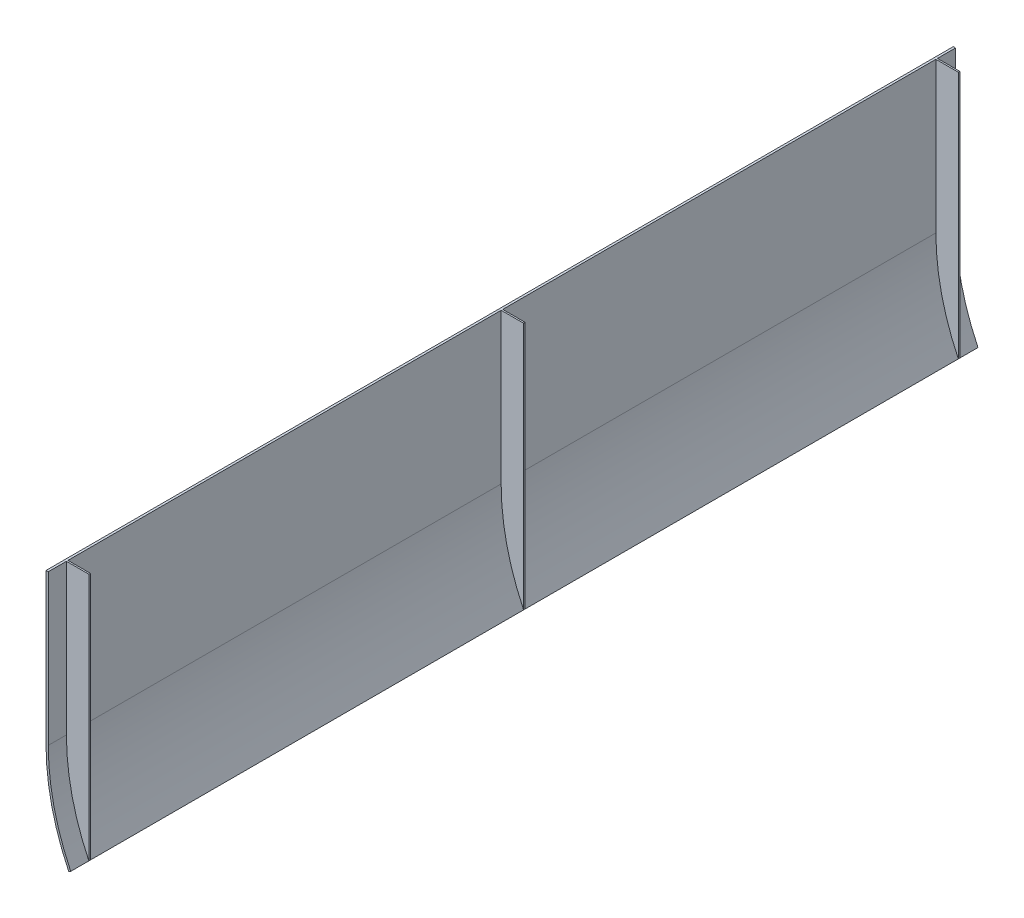
ISO-10303-21;
HEADER;
FILE_DESCRIPTION(('STEP AP214'),'2;1');
FILE_NAME('part.step','',(''),(''),'','','');
FILE_SCHEMA(('AUTOMOTIVE_DESIGN { 1 0 10303 214 1 1 1 1 }'));
ENDSEC;
DATA;
#1=APPLICATION_CONTEXT('core data for automotive mechanical design processes');
#2=APPLICATION_PROTOCOL_DEFINITION('international standard','automotive_design',2000,#1);
#3=PRODUCT_CONTEXT('',#1,'mechanical');
#4=PRODUCT('Part','Part','',(#3));
#5=PRODUCT_RELATED_PRODUCT_CATEGORY('part','',(#4));
#6=PRODUCT_DEFINITION_FORMATION('','',#4);
#7=PRODUCT_DEFINITION_CONTEXT('part definition',#1,'design');
#8=PRODUCT_DEFINITION('design','',#6,#7);
#9=PRODUCT_DEFINITION_SHAPE('','',#8);
#10=(LENGTH_UNIT() NAMED_UNIT(*) SI_UNIT(.MILLI.,.METRE.));
#11=(NAMED_UNIT(*) PLANE_ANGLE_UNIT() SI_UNIT($,.RADIAN.));
#12=(NAMED_UNIT(*) SI_UNIT($,.STERADIAN.) SOLID_ANGLE_UNIT());
#13=UNCERTAINTY_MEASURE_WITH_UNIT(LENGTH_MEASURE(1.E-05),#10,'distance_accuracy_value','');
#14=(GEOMETRIC_REPRESENTATION_CONTEXT(3) GLOBAL_UNCERTAINTY_ASSIGNED_CONTEXT((#13)) GLOBAL_UNIT_ASSIGNED_CONTEXT((#10,
#11,#12)) REPRESENTATION_CONTEXT('',''));
#15=CARTESIAN_POINT('',(0.,0.,0.));
#16=DIRECTION('',(0.,0.,1.));
#17=DIRECTION('',(1.,0.,0.));
#18=AXIS2_PLACEMENT_3D('',#15,#16,#17);
#19=CARTESIAN_POINT('',(270.,130.76696830622,0.));
#20=DIRECTION('',(0.,0.,1.));
#21=DIRECTION('',(1.,0.,0.));
#22=AXIS2_PLACEMENT_3D('',#19,#20,#21);
#23=CYLINDRICAL_SURFACE('',#22,297.);
#24=CARTESIAN_POINT('',(270.,130.76696830622,24.));
#25=DIRECTION('',(0.,0.,-1.));
#26=DIRECTION('',(-1.,0.,0.));
#27=AXIS2_PLACEMENT_3D('',#24,#25,#26);
#28=CIRCLE('',#27,297.);
#29=CARTESIAN_POINT('',(-27.,130.76696830622,24.));
#30=VERTEX_POINT('',#29);
#31=CARTESIAN_POINT('',(2.69999999999998,1.3076696830622,24.));
#32=VERTEX_POINT('',#31);
#33=EDGE_CURVE('E283',#30,#32,#28,.F.);
#34=ORIENTED_EDGE('',*,*,#33,.T.);
#35=DIRECTION('',(0.,0.,1.));
#36=VECTOR('',#35,1.);
#37=CARTESIAN_POINT('',(2.69999999999998,1.3076696830622,0.));
#38=LINE('',#37,#36);
#39=CARTESIAN_POINT('',(2.69999999999998,1.3076696830622,0.));
#40=VERTEX_POINT('',#39);
#41=EDGE_CURVE('E216',#40,#32,#38,.T.);
#42=ORIENTED_EDGE('',*,*,#41,.F.);
#43=CARTESIAN_POINT('',(270.,130.76696830622,0.));
#44=DIRECTION('',(0.,0.,1.));
#45=DIRECTION('',(1.,0.,0.));
#46=AXIS2_PLACEMENT_3D('',#43,#44,#45);
#47=CIRCLE('',#46,297.);
#48=CARTESIAN_POINT('',(-27.,130.76696830622,0.));
#49=VERTEX_POINT('',#48);
#50=EDGE_CURVE('E212',#40,#49,#47,.F.);
#51=ORIENTED_EDGE('',*,*,#50,.T.);
#52=DIRECTION('',(0.,0.,1.));
#53=VECTOR('',#52,1.);
#54=CARTESIAN_POINT('',(-27.,130.76696830622,0.));
#55=LINE('',#54,#53);
#56=EDGE_CURVE('E211',#49,#30,#55,.T.);
#57=ORIENTED_EDGE('',*,*,#56,.T.);
#58=EDGE_LOOP('',(#34,#42,#51,#57));
#59=FACE_BOUND('',#58,.T.);
#60=ADVANCED_FACE('F41',(#59),#23,.F.);
#61=CARTESIAN_POINT('',(-27.,130.76696830622,0.));
#62=DIRECTION('',(1.,0.,0.));
#63=DIRECTION('',(0.,1.,0.));
#64=AXIS2_PLACEMENT_3D('',#61,#62,#63);
#65=PLANE('',#64);
#66=DIRECTION('',(0.,1.,0.));
#67=VECTOR('',#66,1.);
#68=CARTESIAN_POINT('',(-27.,-0.00200000000011302,24.));
#69=LINE('',#68,#67);
#70=CARTESIAN_POINT('',(-27.,329.67,24.));
#71=VERTEX_POINT('',#70);
#72=EDGE_CURVE('E176',#30,#71,#69,.T.);
#73=ORIENTED_EDGE('',*,*,#72,.F.);
#74=ORIENTED_EDGE('',*,*,#56,.F.);
#75=DIRECTION('',(0.,1.,0.));
#76=VECTOR('',#75,1.);
#77=CARTESIAN_POINT('',(-27.,130.76696830622,0.));
#78=LINE('',#77,#76);
#79=CARTESIAN_POINT('',(-27.,329.67,0.));
#80=VERTEX_POINT('',#79);
#81=EDGE_CURVE('E207',#49,#80,#78,.T.);
#82=ORIENTED_EDGE('',*,*,#81,.T.);
#83=DIRECTION('',(0.,0.,1.));
#84=VECTOR('',#83,1.);
#85=CARTESIAN_POINT('',(-27.,329.67,0.));
#86=LINE('',#85,#84);
#87=EDGE_CURVE('E195',#80,#71,#86,.T.);
#88=ORIENTED_EDGE('',*,*,#87,.T.);
#89=EDGE_LOOP('',(#73,#74,#82,#88));
#90=FACE_BOUND('',#89,.T.);
#91=ADVANCED_FACE('F264',(#90),#65,.T.);
#92=CARTESIAN_POINT('',(270.,130.76696830622,26.));
#93=DIRECTION('',(0.,0.,1.));
#94=DIRECTION('',(1.,0.,0.));
#95=AXIS2_PLACEMENT_3D('',#92,#93,#94);
#96=CIRCLE('',#95,297.);
#97=CARTESIAN_POINT('',(2.69999999999998,1.3076696830622,26.));
#98=VERTEX_POINT('',#97);
#99=CARTESIAN_POINT('',(-27.,130.76696830622,26.));
#100=VERTEX_POINT('',#99);
#101=EDGE_CURVE('E187',#98,#100,#96,.F.);
#102=ORIENTED_EDGE('',*,*,#101,.T.);
#103=CARTESIAN_POINT('',(-27.,130.76696830622,599.));
#104=VERTEX_POINT('',#103);
#105=EDGE_CURVE('E185',#100,#104,#55,.T.);
#106=ORIENTED_EDGE('',*,*,#105,.T.);
#107=CARTESIAN_POINT('',(270.,130.76696830622,599.));
#108=DIRECTION('',(0.,0.,-1.));
#109=DIRECTION('',(-1.,0.,0.));
#110=AXIS2_PLACEMENT_3D('',#107,#108,#109);
#111=CIRCLE('',#110,297.);
#112=CARTESIAN_POINT('',(2.69999999999998,1.3076696830622,599.));
#113=VERTEX_POINT('',#112);
#114=EDGE_CURVE('E315',#104,#113,#111,.F.);
#115=ORIENTED_EDGE('',*,*,#114,.T.);
#116=EDGE_CURVE('E220',#98,#113,#38,.T.);
#117=ORIENTED_EDGE('',*,*,#116,.F.);
#118=EDGE_LOOP('',(#102,#106,#115,#117));
#119=FACE_BOUND('',#118,.T.);
#120=ADVANCED_FACE('F384',(#119),#23,.F.);
#121=DIRECTION('',(0.,1.,0.));
#122=VECTOR('',#121,1.);
#123=CARTESIAN_POINT('',(-27.,-0.00200000000011302,26.));
#124=LINE('',#123,#122);
#125=CARTESIAN_POINT('',(-27.,329.67,26.));
#126=VERTEX_POINT('',#125);
#127=EDGE_CURVE('E170',#100,#126,#124,.T.);
#128=ORIENTED_EDGE('',*,*,#127,.T.);
#129=CARTESIAN_POINT('',(-27.,329.67,599.));
#130=VERTEX_POINT('',#129);
#131=EDGE_CURVE('E183',#126,#130,#86,.T.);
#132=ORIENTED_EDGE('',*,*,#131,.T.);
#133=DIRECTION('',(0.,1.,0.));
#134=VECTOR('',#133,1.);
#135=CARTESIAN_POINT('',(-27.,-0.00200000000011302,599.));
#136=LINE('',#135,#134);
#137=EDGE_CURVE('E297',#104,#130,#136,.T.);
#138=ORIENTED_EDGE('',*,*,#137,.F.);
#139=ORIENTED_EDGE('',*,*,#105,.F.);
#140=EDGE_LOOP('',(#128,#132,#138,#139));
#141=FACE_BOUND('',#140,.T.);
#142=ADVANCED_FACE('F181',(#141),#65,.T.);
#143=CARTESIAN_POINT('',(270.,130.76696830622,601.));
#144=DIRECTION('',(0.,0.,1.));
#145=DIRECTION('',(1.,0.,0.));
#146=AXIS2_PLACEMENT_3D('',#143,#144,#145);
#147=CIRCLE('',#146,297.);
#148=CARTESIAN_POINT('',(2.69999999999998,1.3076696830622,601.));
#149=VERTEX_POINT('',#148);
#150=CARTESIAN_POINT('',(-27.,130.76696830622,601.));
#151=VERTEX_POINT('',#150);
#152=EDGE_CURVE('E314',#149,#151,#147,.F.);
#153=ORIENTED_EDGE('',*,*,#152,.T.);
#154=CARTESIAN_POINT('',(-27.,130.76696830622,1174.));
#155=VERTEX_POINT('',#154);
#156=EDGE_CURVE('E386',#151,#155,#55,.T.);
#157=ORIENTED_EDGE('',*,*,#156,.T.);
#158=CARTESIAN_POINT('',(270.,130.76696830622,1174.));
#159=DIRECTION('',(0.,0.,-1.));
#160=DIRECTION('',(-1.,0.,0.));
#161=AXIS2_PLACEMENT_3D('',#158,#159,#160);
#162=CIRCLE('',#161,297.);
#163=CARTESIAN_POINT('',(2.69999999999998,1.3076696830622,1174.));
#164=VERTEX_POINT('',#163);
#165=EDGE_CURVE('E241',#155,#164,#162,.F.);
#166=ORIENTED_EDGE('',*,*,#165,.T.);
#167=EDGE_CURVE('E371',#149,#164,#38,.T.);
#168=ORIENTED_EDGE('',*,*,#167,.F.);
#169=EDGE_LOOP('',(#153,#157,#166,#168));
#170=FACE_BOUND('',#169,.T.);
#171=ADVANCED_FACE('F432',(#170),#23,.F.);
#172=DIRECTION('',(0.,1.,0.));
#173=VECTOR('',#172,1.);
#174=CARTESIAN_POINT('',(-27.,-0.00200000000011302,601.));
#175=LINE('',#174,#173);
#176=CARTESIAN_POINT('',(-27.,329.67,601.));
#177=VERTEX_POINT('',#176);
#178=EDGE_CURVE('E310',#151,#177,#175,.T.);
#179=ORIENTED_EDGE('',*,*,#178,.T.);
#180=CARTESIAN_POINT('',(-27.,329.67,1174.));
#181=VERTEX_POINT('',#180);
#182=EDGE_CURVE('E196',#177,#181,#86,.T.);
#183=ORIENTED_EDGE('',*,*,#182,.T.);
#184=DIRECTION('',(0.,1.,0.));
#185=VECTOR('',#184,1.);
#186=CARTESIAN_POINT('',(-27.,-0.00200000000011302,1174.));
#187=LINE('',#186,#185);
#188=EDGE_CURVE('E331',#155,#181,#187,.T.);
#189=ORIENTED_EDGE('',*,*,#188,.F.);
#190=ORIENTED_EDGE('',*,*,#156,.F.);
#191=EDGE_LOOP('',(#179,#183,#189,#190));
#192=FACE_BOUND('',#191,.T.);
#193=ADVANCED_FACE('F438',(#192),#65,.T.);
#194=CARTESIAN_POINT('',(-30.,130.76696830622,0.));
#195=DIRECTION('',(0.,0.,-1.));
#196=DIRECTION('',(0.,1.,0.));
#197=AXIS2_PLACEMENT_3D('',#194,#195,#196);
#198=PLANE('',#197);
#199=ORIENTED_EDGE('',*,*,#81,.F.);
#200=ORIENTED_EDGE('',*,*,#50,.F.);
#201=DIRECTION('',(0.9,0.435889894354068,0.));
#202=VECTOR('',#201,1.);
#203=CARTESIAN_POINT('',(0.,-1.11022302462516E-13,0.));
#204=LINE('',#203,#202);
#205=CARTESIAN_POINT('',(0.,-1.11022302462516E-13,0.));
#206=VERTEX_POINT('',#205);
#207=EDGE_CURVE('E11',#206,#40,#204,.T.);
#208=ORIENTED_EDGE('',*,*,#207,.F.);
#209=CARTESIAN_POINT('',(270.,130.76696830622,0.));
#210=DIRECTION('',(0.,0.,-1.));
#211=DIRECTION('',(-1.,0.,0.));
#212=AXIS2_PLACEMENT_3D('',#209,#210,#211);
#213=CIRCLE('',#212,300.);
#214=CARTESIAN_POINT('',(-30.,130.76696830622,0.));
#215=VERTEX_POINT('',#214);
#216=EDGE_CURVE('E222',#206,#215,#213,.T.);
#217=ORIENTED_EDGE('',*,*,#216,.T.);
#218=DIRECTION('',(0.,1.,0.));
#219=VECTOR('',#218,1.);
#220=CARTESIAN_POINT('',(-30.,130.76696830622,0.));
#221=LINE('',#220,#219);
#222=CARTESIAN_POINT('',(-30.,329.67,0.));
#223=VERTEX_POINT('',#222);
#224=EDGE_CURVE('E227',#215,#223,#221,.T.);
#225=ORIENTED_EDGE('',*,*,#224,.T.);
#226=DIRECTION('',(1.,0.,0.));
#227=VECTOR('',#226,1.);
#228=CARTESIAN_POINT('',(-30.,329.67,0.));
#229=LINE('',#228,#227);
#230=EDGE_CURVE('E51',#223,#80,#229,.T.);
#231=ORIENTED_EDGE('',*,*,#230,.T.);
#232=EDGE_LOOP('',(#199,#200,#208,#217,#225,#231));
#233=FACE_BOUND('',#232,.T.);
#234=ADVANCED_FACE('F256',(#233),#198,.T.);
#235=CARTESIAN_POINT('',(-30.,329.67,0.));
#236=DIRECTION('',(0.,1.,0.));
#237=DIRECTION('',(0.,0.,1.));
#238=AXIS2_PLACEMENT_3D('',#235,#236,#237);
#239=PLANE('',#238);
#240=ORIENTED_EDGE('',*,*,#230,.F.);
#241=DIRECTION('',(0.,0.,1.));
#242=VECTOR('',#241,1.);
#243=CARTESIAN_POINT('',(-30.,329.67,0.));
#244=LINE('',#243,#242);
#245=CARTESIAN_POINT('',(-30.,329.67,1200.));
#246=VERTEX_POINT('',#245);
#247=EDGE_CURVE('E231',#223,#246,#244,.T.);
#248=ORIENTED_EDGE('',*,*,#247,.T.);
#249=DIRECTION('',(1.,0.,0.));
#250=VECTOR('',#249,1.);
#251=CARTESIAN_POINT('',(-30.,329.67,1200.));
#252=LINE('',#251,#250);
#253=CARTESIAN_POINT('',(-27.,329.67,1200.));
#254=VERTEX_POINT('',#253);
#255=EDGE_CURVE('E250',#246,#254,#252,.T.);
#256=ORIENTED_EDGE('',*,*,#255,.T.);
#257=CARTESIAN_POINT('',(-27.,329.67,1176.));
#258=VERTEX_POINT('',#257);
#259=EDGE_CURVE('E202',#258,#254,#86,.T.);
#260=ORIENTED_EDGE('',*,*,#259,.F.);
#261=DIRECTION('',(1.,0.,0.));
#262=VECTOR('',#261,1.);
#263=CARTESIAN_POINT('',(-27.,329.67,1176.));
#264=LINE('',#263,#262);
#265=CARTESIAN_POINT('',(2.69999999999998,329.67,1176.));
#266=VERTEX_POINT('',#265);
#267=EDGE_CURVE('E327',#258,#266,#264,.T.);
#268=ORIENTED_EDGE('',*,*,#267,.T.);
#269=DIRECTION('',(0.,0.,-1.));
#270=VECTOR('',#269,1.);
#271=CARTESIAN_POINT('',(2.69999999999998,329.67,1176.));
#272=LINE('',#271,#270);
#273=CARTESIAN_POINT('',(2.69999999999998,329.67,1174.));
#274=VERTEX_POINT('',#273);
#275=EDGE_CURVE('E332',#266,#274,#272,.T.);
#276=ORIENTED_EDGE('',*,*,#275,.T.);
#277=DIRECTION('',(-1.,0.,0.));
#278=VECTOR('',#277,1.);
#279=CARTESIAN_POINT('',(-27.,329.67,1174.));
#280=LINE('',#279,#278);
#281=EDGE_CURVE('E319',#274,#181,#280,.T.);
#282=ORIENTED_EDGE('',*,*,#281,.T.);
#283=ORIENTED_EDGE('',*,*,#182,.F.);
#284=DIRECTION('',(1.,0.,0.));
#285=VECTOR('',#284,1.);
#286=CARTESIAN_POINT('',(-27.,329.67,601.));
#287=LINE('',#286,#285);
#288=CARTESIAN_POINT('',(2.69999999999998,329.67,601.));
#289=VERTEX_POINT('',#288);
#290=EDGE_CURVE('E293',#177,#289,#287,.T.);
#291=ORIENTED_EDGE('',*,*,#290,.T.);
#292=DIRECTION('',(0.,0.,-1.));
#293=VECTOR('',#292,1.);
#294=CARTESIAN_POINT('',(2.69999999999998,329.67,601.));
#295=LINE('',#294,#293);
#296=CARTESIAN_POINT('',(2.69999999999998,329.67,599.));
#297=VERTEX_POINT('',#296);
#298=EDGE_CURVE('E298',#289,#297,#295,.T.);
#299=ORIENTED_EDGE('',*,*,#298,.T.);
#300=DIRECTION('',(-1.,0.,0.));
#301=VECTOR('',#300,1.);
#302=CARTESIAN_POINT('',(-27.,329.67,599.));
#303=LINE('',#302,#301);
#304=EDGE_CURVE('E193',#297,#130,#303,.T.);
#305=ORIENTED_EDGE('',*,*,#304,.T.);
#306=ORIENTED_EDGE('',*,*,#131,.F.);
#307=DIRECTION('',(1.,0.,0.));
#308=VECTOR('',#307,1.);
#309=CARTESIAN_POINT('',(-27.,329.67,26.));
#310=LINE('',#309,#308);
#311=CARTESIAN_POINT('',(2.69999999999998,329.67,26.));
#312=VERTEX_POINT('',#311);
#313=EDGE_CURVE('E167',#126,#312,#310,.T.);
#314=ORIENTED_EDGE('',*,*,#313,.T.);
#315=DIRECTION('',(0.,0.,-1.));
#316=VECTOR('',#315,1.);
#317=CARTESIAN_POINT('',(2.69999999999998,329.67,26.));
#318=LINE('',#317,#316);
#319=CARTESIAN_POINT('',(2.69999999999998,329.67,24.));
#320=VERTEX_POINT('',#319);
#321=EDGE_CURVE('E177',#312,#320,#318,.T.);
#322=ORIENTED_EDGE('',*,*,#321,.T.);
#323=DIRECTION('',(-1.,0.,0.));
#324=VECTOR('',#323,1.);
#325=CARTESIAN_POINT('',(-27.,329.67,24.));
#326=LINE('',#325,#324);
#327=EDGE_CURVE('E268',#320,#71,#326,.T.);
#328=ORIENTED_EDGE('',*,*,#327,.T.);
#329=ORIENTED_EDGE('',*,*,#87,.F.);
#330=EDGE_LOOP('',(#240,#248,#256,#260,#268,#276,#282,#283,#291,#299,#305,#306,#314,#322,#328,#329));
#331=FACE_BOUND('',#330,.T.);
#332=ADVANCED_FACE('F190',(#331),#239,.T.);
#333=CARTESIAN_POINT('',(270.,130.76696830622,1200.));
#334=DIRECTION('',(0.,0.,1.));
#335=DIRECTION('',(1.,0.,0.));
#336=AXIS2_PLACEMENT_3D('',#333,#334,#335);
#337=PLANE('',#336);
#338=CARTESIAN_POINT('',(270.,130.76696830622,1200.));
#339=DIRECTION('',(0.,0.,1.));
#340=DIRECTION('',(1.,0.,0.));
#341=AXIS2_PLACEMENT_3D('',#338,#339,#340);
#342=CIRCLE('',#341,297.);
#343=CARTESIAN_POINT('',(2.69999999999998,1.3076696830622,1200.));
#344=VERTEX_POINT('',#343);
#345=CARTESIAN_POINT('',(-27.,130.76696830622,1200.));
#346=VERTEX_POINT('',#345);
#347=EDGE_CURVE('E201',#344,#346,#342,.F.);
#348=ORIENTED_EDGE('',*,*,#347,.T.);
#349=DIRECTION('',(0.,1.,0.));
#350=VECTOR('',#349,1.);
#351=CARTESIAN_POINT('',(-27.,130.76696830622,1200.));
#352=LINE('',#351,#350);
#353=EDGE_CURVE('E205',#346,#254,#352,.T.);
#354=ORIENTED_EDGE('',*,*,#353,.T.);
#355=ORIENTED_EDGE('',*,*,#255,.F.);
#356=DIRECTION('',(0.,1.,0.));
#357=VECTOR('',#356,1.);
#358=CARTESIAN_POINT('',(-30.,130.76696830622,1200.));
#359=LINE('',#358,#357);
#360=CARTESIAN_POINT('',(-30.,130.76696830622,1200.));
#361=VERTEX_POINT('',#360);
#362=EDGE_CURVE('E237',#361,#246,#359,.T.);
#363=ORIENTED_EDGE('',*,*,#362,.F.);
#364=CARTESIAN_POINT('',(270.,130.76696830622,1200.));
#365=DIRECTION('',(0.,0.,-1.));
#366=DIRECTION('',(-1.,0.,0.));
#367=AXIS2_PLACEMENT_3D('',#364,#365,#366);
#368=CIRCLE('',#367,300.);
#369=CARTESIAN_POINT('',(0.,-1.11022302462516E-13,1200.));
#370=VERTEX_POINT('',#369);
#371=EDGE_CURVE('E233',#370,#361,#368,.T.);
#372=ORIENTED_EDGE('',*,*,#371,.F.);
#373=DIRECTION('',(0.9,0.435889894354068,0.));
#374=VECTOR('',#373,1.);
#375=CARTESIAN_POINT('',(0.,-1.11022302462516E-13,1200.));
#376=LINE('',#375,#374);
#377=EDGE_CURVE('E45',#370,#344,#376,.T.);
#378=ORIENTED_EDGE('',*,*,#377,.T.);
#379=EDGE_LOOP('',(#348,#354,#355,#363,#372,#378));
#380=FACE_BOUND('',#379,.T.);
#381=ADVANCED_FACE('F396',(#380),#337,.T.);
#382=CARTESIAN_POINT('',(0.,-1.11022302462516E-13,600.));
#383=DIRECTION('',(0.435889894354068,-0.9,0.));
#384=DIRECTION('',(0.,0.,1.));
#385=AXIS2_PLACEMENT_3D('',#382,#383,#384);
#386=PLANE('',#385);
#387=DIRECTION('',(0.,0.,1.));
#388=VECTOR('',#387,1.);
#389=CARTESIAN_POINT('',(0.,-1.11022302462516E-13,0.));
#390=LINE('',#389,#388);
#391=EDGE_CURVE('E226',#206,#370,#390,.T.);
#392=ORIENTED_EDGE('',*,*,#391,.F.);
#393=ORIENTED_EDGE('',*,*,#207,.T.);
#394=ORIENTED_EDGE('',*,*,#41,.T.);
#395=DIRECTION('',(0.,0.,1.));
#396=VECTOR('',#395,1.);
#397=CARTESIAN_POINT('',(2.69999999999998,1.3076696830622,0.));
#398=LINE('',#397,#396);
#399=EDGE_CURVE('E287',#32,#98,#398,.T.);
#400=ORIENTED_EDGE('',*,*,#399,.T.);
#401=ORIENTED_EDGE('',*,*,#116,.T.);
#402=DIRECTION('',(0.,0.,1.));
#403=VECTOR('',#402,1.);
#404=CARTESIAN_POINT('',(2.69999999999998,1.3076696830622,0.));
#405=LINE('',#404,#403);
#406=EDGE_CURVE('E320',#113,#149,#405,.T.);
#407=ORIENTED_EDGE('',*,*,#406,.T.);
#408=ORIENTED_EDGE('',*,*,#167,.T.);
#409=DIRECTION('',(0.,0.,1.));
#410=VECTOR('',#409,1.);
#411=CARTESIAN_POINT('',(2.69999999999998,1.3076696830622,0.));
#412=LINE('',#411,#410);
#413=CARTESIAN_POINT('',(2.69999999999998,1.3076696830622,1176.));
#414=VERTEX_POINT('',#413);
#415=EDGE_CURVE('E356',#164,#414,#412,.T.);
#416=ORIENTED_EDGE('',*,*,#415,.T.);
#417=EDGE_CURVE('E221',#414,#344,#38,.T.);
#418=ORIENTED_EDGE('',*,*,#417,.T.);
#419=ORIENTED_EDGE('',*,*,#377,.F.);
#420=EDGE_LOOP('',(#392,#393,#394,#400,#401,#407,#408,#416,#418,#419));
#421=FACE_BOUND('',#420,.T.);
#422=ADVANCED_FACE('F43',(#421),#386,.T.);
#423=CARTESIAN_POINT('',(270.,130.76696830622,1176.));
#424=DIRECTION('',(0.,0.,1.));
#425=DIRECTION('',(1.,0.,0.));
#426=AXIS2_PLACEMENT_3D('',#423,#424,#425);
#427=CIRCLE('',#426,297.);
#428=CARTESIAN_POINT('',(-27.,130.76696830622,1176.));
#429=VERTEX_POINT('',#428);
#430=EDGE_CURVE('E352',#414,#429,#427,.F.);
#431=ORIENTED_EDGE('',*,*,#430,.T.);
#432=EDGE_CURVE('E363',#429,#346,#55,.T.);
#433=ORIENTED_EDGE('',*,*,#432,.T.);
#434=ORIENTED_EDGE('',*,*,#347,.F.);
#435=ORIENTED_EDGE('',*,*,#417,.F.);
#436=EDGE_LOOP('',(#431,#433,#434,#435));
#437=FACE_BOUND('',#436,.T.);
#438=ADVANCED_FACE('F425',(#437),#23,.F.);
#439=DIRECTION('',(0.,1.,0.));
#440=VECTOR('',#439,1.);
#441=CARTESIAN_POINT('',(-27.,-0.00200000000011302,1176.));
#442=LINE('',#441,#440);
#443=EDGE_CURVE('E348',#429,#258,#442,.T.);
#444=ORIENTED_EDGE('',*,*,#443,.T.);
#445=ORIENTED_EDGE('',*,*,#259,.T.);
#446=ORIENTED_EDGE('',*,*,#353,.F.);
#447=ORIENTED_EDGE('',*,*,#432,.F.);
#448=EDGE_LOOP('',(#444,#445,#446,#447));
#449=FACE_BOUND('',#448,.T.);
#450=ADVANCED_FACE('F399',(#449),#65,.T.);
#451=CARTESIAN_POINT('',(270.,130.76696830622,0.));
#452=DIRECTION('',(0.,0.,1.));
#453=DIRECTION('',(1.,0.,0.));
#454=AXIS2_PLACEMENT_3D('',#451,#452,#453);
#455=CYLINDRICAL_SURFACE('',#454,300.);
#456=ORIENTED_EDGE('',*,*,#371,.T.);
#457=DIRECTION('',(0.,0.,1.));
#458=VECTOR('',#457,1.);
#459=CARTESIAN_POINT('',(-30.,130.76696830622,0.));
#460=LINE('',#459,#458);
#461=EDGE_CURVE('E232',#215,#361,#460,.T.);
#462=ORIENTED_EDGE('',*,*,#461,.F.);
#463=ORIENTED_EDGE('',*,*,#216,.F.);
#464=ORIENTED_EDGE('',*,*,#391,.T.);
#465=EDGE_LOOP('',(#456,#462,#463,#464));
#466=FACE_BOUND('',#465,.T.);
#467=ADVANCED_FACE('F407',(#466),#455,.T.);
#468=CARTESIAN_POINT('',(-30.,130.76696830622,0.));
#469=DIRECTION('',(1.,0.,0.));
#470=DIRECTION('',(0.,1.,0.));
#471=AXIS2_PLACEMENT_3D('',#468,#469,#470);
#472=PLANE('',#471);
#473=ORIENTED_EDGE('',*,*,#362,.T.);
#474=ORIENTED_EDGE('',*,*,#247,.F.);
#475=ORIENTED_EDGE('',*,*,#224,.F.);
#476=ORIENTED_EDGE('',*,*,#461,.T.);
#477=EDGE_LOOP('',(#473,#474,#475,#476));
#478=FACE_BOUND('',#477,.T.);
#479=ADVANCED_FACE('F404',(#478),#472,.F.);
#480=CARTESIAN_POINT('',(-27.,-0.00200000000011302,1174.));
#481=DIRECTION('',(0.,0.,-1.));
#482=DIRECTION('',(-1.,0.,0.));
#483=AXIS2_PLACEMENT_3D('',#480,#481,#482);
#484=PLANE('',#483);
#485=ORIENTED_EDGE('',*,*,#165,.F.);
#486=ORIENTED_EDGE('',*,*,#188,.T.);
#487=ORIENTED_EDGE('',*,*,#281,.F.);
#488=DIRECTION('',(0.,1.,0.));
#489=VECTOR('',#488,1.);
#490=CARTESIAN_POINT('',(2.69999999999998,-0.00200000000011302,1174.));
#491=LINE('',#490,#489);
#492=EDGE_CURVE('E342',#164,#274,#491,.T.);
#493=ORIENTED_EDGE('',*,*,#492,.F.);
#494=EDGE_LOOP('',(#485,#486,#487,#493));
#495=FACE_BOUND('',#494,.T.);
#496=ADVANCED_FACE('F451',(#495),#484,.T.);
#497=CARTESIAN_POINT('',(2.69999999999998,-0.00200000000011302,1176.));
#498=DIRECTION('',(1.,0.,0.));
#499=DIRECTION('',(0.,0.,-1.));
#500=AXIS2_PLACEMENT_3D('',#497,#498,#499);
#501=PLANE('',#500);
#502=ORIENTED_EDGE('',*,*,#415,.F.);
#503=ORIENTED_EDGE('',*,*,#492,.T.);
#504=ORIENTED_EDGE('',*,*,#275,.F.);
#505=DIRECTION('',(0.,1.,0.));
#506=VECTOR('',#505,1.);
#507=CARTESIAN_POINT('',(2.69999999999998,-0.00200000000011302,1176.));
#508=LINE('',#507,#506);
#509=EDGE_CURVE('E345',#414,#266,#508,.T.);
#510=ORIENTED_EDGE('',*,*,#509,.F.);
#511=EDGE_LOOP('',(#502,#503,#504,#510));
#512=FACE_BOUND('',#511,.T.);
#513=ADVANCED_FACE('F455',(#512),#501,.T.);
#514=CARTESIAN_POINT('',(-27.,-0.00200000000011302,1176.));
#515=DIRECTION('',(0.,0.,1.));
#516=DIRECTION('',(1.,0.,0.));
#517=AXIS2_PLACEMENT_3D('',#514,#515,#516);
#518=PLANE('',#517);
#519=ORIENTED_EDGE('',*,*,#430,.F.);
#520=ORIENTED_EDGE('',*,*,#509,.T.);
#521=ORIENTED_EDGE('',*,*,#267,.F.);
#522=ORIENTED_EDGE('',*,*,#443,.F.);
#523=EDGE_LOOP('',(#519,#520,#521,#522));
#524=FACE_BOUND('',#523,.T.);
#525=ADVANCED_FACE('F459',(#524),#518,.T.);
#526=CARTESIAN_POINT('',(-27.,-0.00200000000011302,599.));
#527=DIRECTION('',(0.,0.,-1.));
#528=DIRECTION('',(-1.,0.,0.));
#529=AXIS2_PLACEMENT_3D('',#526,#527,#528);
#530=PLANE('',#529);
#531=ORIENTED_EDGE('',*,*,#114,.F.);
#532=ORIENTED_EDGE('',*,*,#137,.T.);
#533=ORIENTED_EDGE('',*,*,#304,.F.);
#534=DIRECTION('',(0.,1.,0.));
#535=VECTOR('',#534,1.);
#536=CARTESIAN_POINT('',(2.69999999999998,-0.00200000000011302,599.));
#537=LINE('',#536,#535);
#538=EDGE_CURVE('E305',#113,#297,#537,.T.);
#539=ORIENTED_EDGE('',*,*,#538,.F.);
#540=EDGE_LOOP('',(#531,#532,#533,#539));
#541=FACE_BOUND('',#540,.T.);
#542=ADVANCED_FACE('F383',(#541),#530,.T.);
#543=CARTESIAN_POINT('',(2.69999999999998,-0.00200000000011302,601.));
#544=DIRECTION('',(1.,0.,0.));
#545=DIRECTION('',(0.,0.,-1.));
#546=AXIS2_PLACEMENT_3D('',#543,#544,#545);
#547=PLANE('',#546);
#548=ORIENTED_EDGE('',*,*,#406,.F.);
#549=ORIENTED_EDGE('',*,*,#538,.T.);
#550=ORIENTED_EDGE('',*,*,#298,.F.);
#551=DIRECTION('',(0.,1.,0.));
#552=VECTOR('',#551,1.);
#553=CARTESIAN_POINT('',(2.69999999999998,-0.00200000000011302,601.));
#554=LINE('',#553,#552);
#555=EDGE_CURVE('E66',#149,#289,#554,.T.);
#556=ORIENTED_EDGE('',*,*,#555,.F.);
#557=EDGE_LOOP('',(#548,#549,#550,#556));
#558=FACE_BOUND('',#557,.T.);
#559=ADVANCED_FACE('F380',(#558),#547,.T.);
#560=CARTESIAN_POINT('',(-27.,-0.00200000000011302,601.));
#561=DIRECTION('',(0.,0.,1.));
#562=DIRECTION('',(1.,0.,0.));
#563=AXIS2_PLACEMENT_3D('',#560,#561,#562);
#564=PLANE('',#563);
#565=ORIENTED_EDGE('',*,*,#152,.F.);
#566=ORIENTED_EDGE('',*,*,#555,.T.);
#567=ORIENTED_EDGE('',*,*,#290,.F.);
#568=ORIENTED_EDGE('',*,*,#178,.F.);
#569=EDGE_LOOP('',(#565,#566,#567,#568));
#570=FACE_BOUND('',#569,.T.);
#571=ADVANCED_FACE('F421',(#570),#564,.T.);
#572=CARTESIAN_POINT('',(-27.,-0.00200000000011302,24.));
#573=DIRECTION('',(0.,0.,-1.));
#574=DIRECTION('',(-1.,0.,0.));
#575=AXIS2_PLACEMENT_3D('',#572,#573,#574);
#576=PLANE('',#575);
#577=ORIENTED_EDGE('',*,*,#33,.F.);
#578=ORIENTED_EDGE('',*,*,#72,.T.);
#579=ORIENTED_EDGE('',*,*,#327,.F.);
#580=DIRECTION('',(0.,1.,0.));
#581=VECTOR('',#580,1.);
#582=CARTESIAN_POINT('',(2.69999999999998,-0.00200000000011302,24.));
#583=LINE('',#582,#581);
#584=EDGE_CURVE('E278',#32,#320,#583,.T.);
#585=ORIENTED_EDGE('',*,*,#584,.F.);
#586=EDGE_LOOP('',(#577,#578,#579,#585));
#587=FACE_BOUND('',#586,.T.);
#588=ADVANCED_FACE('F412',(#587),#576,.T.);
#589=CARTESIAN_POINT('',(2.69999999999998,-0.00200000000011302,26.));
#590=DIRECTION('',(1.,0.,0.));
#591=DIRECTION('',(0.,0.,-1.));
#592=AXIS2_PLACEMENT_3D('',#589,#590,#591);
#593=PLANE('',#592);
#594=ORIENTED_EDGE('',*,*,#399,.F.);
#595=ORIENTED_EDGE('',*,*,#584,.T.);
#596=ORIENTED_EDGE('',*,*,#321,.F.);
#597=DIRECTION('',(0.,1.,0.));
#598=VECTOR('',#597,1.);
#599=CARTESIAN_POINT('',(2.69999999999998,-0.00200000000011302,26.));
#600=LINE('',#599,#598);
#601=EDGE_CURVE('E58',#98,#312,#600,.T.);
#602=ORIENTED_EDGE('',*,*,#601,.F.);
#603=EDGE_LOOP('',(#594,#595,#596,#602));
#604=FACE_BOUND('',#603,.T.);
#605=ADVANCED_FACE('F413',(#604),#593,.T.);
#606=CARTESIAN_POINT('',(-27.,-0.00200000000011302,26.));
#607=DIRECTION('',(0.,0.,1.));
#608=DIRECTION('',(1.,0.,0.));
#609=AXIS2_PLACEMENT_3D('',#606,#607,#608);
#610=PLANE('',#609);
#611=ORIENTED_EDGE('',*,*,#101,.F.);
#612=ORIENTED_EDGE('',*,*,#601,.T.);
#613=ORIENTED_EDGE('',*,*,#313,.F.);
#614=ORIENTED_EDGE('',*,*,#127,.F.);
#615=EDGE_LOOP('',(#611,#612,#613,#614));
#616=FACE_BOUND('',#615,.T.);
#617=ADVANCED_FACE('F169',(#616),#610,.T.);
#618=CLOSED_SHELL('',(#60,#91,#120,#142,#171,#193,#234,#332,#381,#422,#438,#450,#467,#479,#496,
#513,#525,#542,#559,#571,#588,#605,#617));
#619=MANIFOLD_SOLID_BREP('B2',#618);
#620=ADVANCED_BREP_SHAPE_REPRESENTATION('',(#18,#619),#14);
#621=SHAPE_DEFINITION_REPRESENTATION(#9,#620);
ENDSEC;
END-ISO-10303-21;
